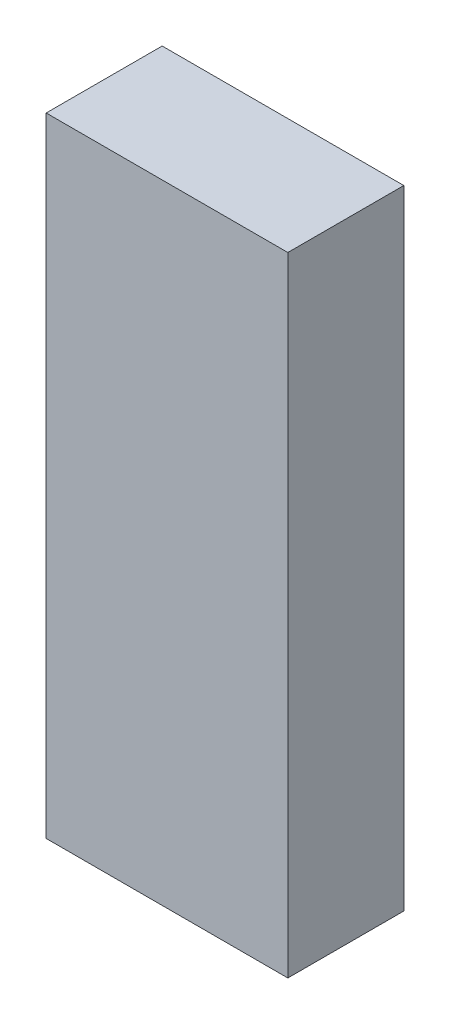
ISO-10303-21;
HEADER;
FILE_DESCRIPTION(('STEP AP214'),'2;1');
FILE_NAME('part.step','',(''),(''),'','','');
FILE_SCHEMA(('AUTOMOTIVE_DESIGN { 1 0 10303 214 1 1 1 1 }'));
ENDSEC;
DATA;
#1=APPLICATION_CONTEXT('core data for automotive mechanical design processes');
#2=APPLICATION_PROTOCOL_DEFINITION('international standard','automotive_design',2000,#1);
#3=PRODUCT_CONTEXT('',#1,'mechanical');
#4=PRODUCT('Part','Part','',(#3));
#5=PRODUCT_RELATED_PRODUCT_CATEGORY('part','',(#4));
#6=PRODUCT_DEFINITION_FORMATION('','',#4);
#7=PRODUCT_DEFINITION_CONTEXT('part definition',#1,'design');
#8=PRODUCT_DEFINITION('design','',#6,#7);
#9=PRODUCT_DEFINITION_SHAPE('','',#8);
#10=(LENGTH_UNIT() NAMED_UNIT(*) SI_UNIT(.MILLI.,.METRE.));
#11=(NAMED_UNIT(*) PLANE_ANGLE_UNIT() SI_UNIT($,.RADIAN.));
#12=(NAMED_UNIT(*) SI_UNIT($,.STERADIAN.) SOLID_ANGLE_UNIT());
#13=UNCERTAINTY_MEASURE_WITH_UNIT(LENGTH_MEASURE(1.E-05),#10,'distance_accuracy_value','');
#14=(GEOMETRIC_REPRESENTATION_CONTEXT(3) GLOBAL_UNCERTAINTY_ASSIGNED_CONTEXT((#13)) GLOBAL_UNIT_ASSIGNED_CONTEXT((#10,
#11,#12)) REPRESENTATION_CONTEXT('',''));
#15=CARTESIAN_POINT('',(0.,0.,0.));
#16=DIRECTION('',(0.,0.,1.));
#17=DIRECTION('',(1.,0.,0.));
#18=AXIS2_PLACEMENT_3D('',#15,#16,#17);
#19=CARTESIAN_POINT('',(0.,0.,12.));
#20=DIRECTION('',(-1.,0.,0.));
#21=DIRECTION('',(0.,0.,1.));
#22=AXIS2_PLACEMENT_3D('',#19,#20,#21);
#23=PLANE('',#22);
#24=DIRECTION('',(0.,1.,0.));
#25=VECTOR('',#24,1.);
#26=CARTESIAN_POINT('',(0.,0.,0.));
#27=LINE('',#26,#25);
#28=CARTESIAN_POINT('',(0.,0.,0.));
#29=VERTEX_POINT('',#28);
#30=CARTESIAN_POINT('',(0.,65.,0.));
#31=VERTEX_POINT('',#30);
#32=EDGE_CURVE('E96',#29,#31,#27,.T.);
#33=ORIENTED_EDGE('',*,*,#32,.T.);
#34=DIRECTION('',(0.,0.,-1.));
#35=VECTOR('',#34,1.);
#36=CARTESIAN_POINT('',(0.,65.,12.));
#37=LINE('',#36,#35);
#38=CARTESIAN_POINT('',(0.,65.,12.));
#39=VERTEX_POINT('',#38);
#40=EDGE_CURVE('E11',#39,#31,#37,.T.);
#41=ORIENTED_EDGE('',*,*,#40,.F.);
#42=DIRECTION('',(0.,1.,0.));
#43=VECTOR('',#42,1.);
#44=CARTESIAN_POINT('',(0.,0.,12.));
#45=LINE('',#44,#43);
#46=CARTESIAN_POINT('',(0.,0.,12.));
#47=VERTEX_POINT('',#46);
#48=EDGE_CURVE('E84',#47,#39,#45,.T.);
#49=ORIENTED_EDGE('',*,*,#48,.F.);
#50=DIRECTION('',(0.,0.,-1.));
#51=VECTOR('',#50,1.);
#52=CARTESIAN_POINT('',(0.,0.,12.));
#53=LINE('',#52,#51);
#54=EDGE_CURVE('E92',#47,#29,#53,.T.);
#55=ORIENTED_EDGE('',*,*,#54,.T.);
#56=EDGE_LOOP('',(#33,#41,#49,#55));
#57=FACE_BOUND('',#56,.T.);
#58=ADVANCED_FACE('F33',(#57),#23,.F.);
#59=CARTESIAN_POINT('',(0.,65.,12.));
#60=DIRECTION('',(0.,-1.,0.));
#61=DIRECTION('',(0.,0.,-1.));
#62=AXIS2_PLACEMENT_3D('',#59,#60,#61);
#63=PLANE('',#62);
#64=DIRECTION('',(-1.,0.,0.));
#65=VECTOR('',#64,1.);
#66=CARTESIAN_POINT('',(0.,65.,0.));
#67=LINE('',#66,#65);
#68=CARTESIAN_POINT('',(-25.,65.,0.));
#69=VERTEX_POINT('',#68);
#70=EDGE_CURVE('E88',#31,#69,#67,.T.);
#71=ORIENTED_EDGE('',*,*,#70,.T.);
#72=DIRECTION('',(0.,0.,-1.));
#73=VECTOR('',#72,1.);
#74=CARTESIAN_POINT('',(-25.,65.,12.));
#75=LINE('',#74,#73);
#76=CARTESIAN_POINT('',(-25.,65.,12.));
#77=VERTEX_POINT('',#76);
#78=EDGE_CURVE('E41',#77,#69,#75,.T.);
#79=ORIENTED_EDGE('',*,*,#78,.F.);
#80=DIRECTION('',(-1.,0.,0.));
#81=VECTOR('',#80,1.);
#82=CARTESIAN_POINT('',(0.,65.,12.));
#83=LINE('',#82,#81);
#84=EDGE_CURVE('E79',#39,#77,#83,.T.);
#85=ORIENTED_EDGE('',*,*,#84,.F.);
#86=ORIENTED_EDGE('',*,*,#40,.T.);
#87=EDGE_LOOP('',(#71,#79,#85,#86));
#88=FACE_BOUND('',#87,.T.);
#89=ADVANCED_FACE('F87',(#88),#63,.F.);
#90=CARTESIAN_POINT('',(-25.,0.,12.));
#91=DIRECTION('',(1.,0.,0.));
#92=DIRECTION('',(0.,0.,-1.));
#93=AXIS2_PLACEMENT_3D('',#90,#91,#92);
#94=PLANE('',#93);
#95=DIRECTION('',(0.,-1.,0.));
#96=VECTOR('',#95,1.);
#97=CARTESIAN_POINT('',(-25.,0.,0.));
#98=LINE('',#97,#96);
#99=CARTESIAN_POINT('',(-25.,0.,0.));
#100=VERTEX_POINT('',#99);
#101=EDGE_CURVE('E66',#69,#100,#98,.T.);
#102=ORIENTED_EDGE('',*,*,#101,.T.);
#103=DIRECTION('',(0.,0.,-1.));
#104=VECTOR('',#103,1.);
#105=CARTESIAN_POINT('',(-25.,0.,12.));
#106=LINE('',#105,#104);
#107=CARTESIAN_POINT('',(-25.,0.,12.));
#108=VERTEX_POINT('',#107);
#109=EDGE_CURVE('E89',#108,#100,#106,.T.);
#110=ORIENTED_EDGE('',*,*,#109,.F.);
#111=DIRECTION('',(0.,-1.,0.));
#112=VECTOR('',#111,1.);
#113=CARTESIAN_POINT('',(-25.,0.,12.));
#114=LINE('',#113,#112);
#115=EDGE_CURVE('E82',#77,#108,#114,.T.);
#116=ORIENTED_EDGE('',*,*,#115,.F.);
#117=ORIENTED_EDGE('',*,*,#78,.T.);
#118=EDGE_LOOP('',(#102,#110,#116,#117));
#119=FACE_BOUND('',#118,.T.);
#120=ADVANCED_FACE('F90',(#119),#94,.F.);
#121=CARTESIAN_POINT('',(0.,0.,12.));
#122=DIRECTION('',(0.,1.,0.));
#123=DIRECTION('',(0.,0.,1.));
#124=AXIS2_PLACEMENT_3D('',#121,#122,#123);
#125=PLANE('',#124);
#126=DIRECTION('',(1.,0.,0.));
#127=VECTOR('',#126,1.);
#128=CARTESIAN_POINT('',(0.,0.,0.));
#129=LINE('',#128,#127);
#130=EDGE_CURVE('E72',#100,#29,#129,.T.);
#131=ORIENTED_EDGE('',*,*,#130,.T.);
#132=ORIENTED_EDGE('',*,*,#54,.F.);
#133=DIRECTION('',(1.,0.,0.));
#134=VECTOR('',#133,1.);
#135=CARTESIAN_POINT('',(0.,0.,12.));
#136=LINE('',#135,#134);
#137=EDGE_CURVE('E49',#108,#47,#136,.T.);
#138=ORIENTED_EDGE('',*,*,#137,.F.);
#139=ORIENTED_EDGE('',*,*,#109,.T.);
#140=EDGE_LOOP('',(#131,#132,#138,#139));
#141=FACE_BOUND('',#140,.T.);
#142=ADVANCED_FACE('F103',(#141),#125,.F.);
#143=CARTESIAN_POINT('',(0.,0.,12.));
#144=DIRECTION('',(0.,0.,1.));
#145=DIRECTION('',(1.,0.,0.));
#146=AXIS2_PLACEMENT_3D('',#143,#144,#145);
#147=PLANE('',#146);
#148=ORIENTED_EDGE('',*,*,#48,.T.);
#149=ORIENTED_EDGE('',*,*,#84,.T.);
#150=ORIENTED_EDGE('',*,*,#115,.T.);
#151=ORIENTED_EDGE('',*,*,#137,.T.);
#152=EDGE_LOOP('',(#148,#149,#150,#151));
#153=FACE_BOUND('',#152,.T.);
#154=ADVANCED_FACE('F80',(#153),#147,.T.);
#155=CARTESIAN_POINT('',(0.,0.,0.));
#156=DIRECTION('',(0.,0.,1.));
#157=DIRECTION('',(1.,0.,0.));
#158=AXIS2_PLACEMENT_3D('',#155,#156,#157);
#159=PLANE('',#158);
#160=ORIENTED_EDGE('',*,*,#32,.F.);
#161=ORIENTED_EDGE('',*,*,#130,.F.);
#162=ORIENTED_EDGE('',*,*,#101,.F.);
#163=ORIENTED_EDGE('',*,*,#70,.F.);
#164=EDGE_LOOP('',(#160,#161,#162,#163));
#165=FACE_BOUND('',#164,.T.);
#166=ADVANCED_FACE('F106',(#165),#159,.F.);
#167=CLOSED_SHELL('',(#58,#89,#120,#142,#154,#166));
#168=MANIFOLD_SOLID_BREP('B2',#167);
#169=ADVANCED_BREP_SHAPE_REPRESENTATION('',(#18,#168),#14);
#170=SHAPE_DEFINITION_REPRESENTATION(#9,#169);
ENDSEC;
END-ISO-10303-21;
